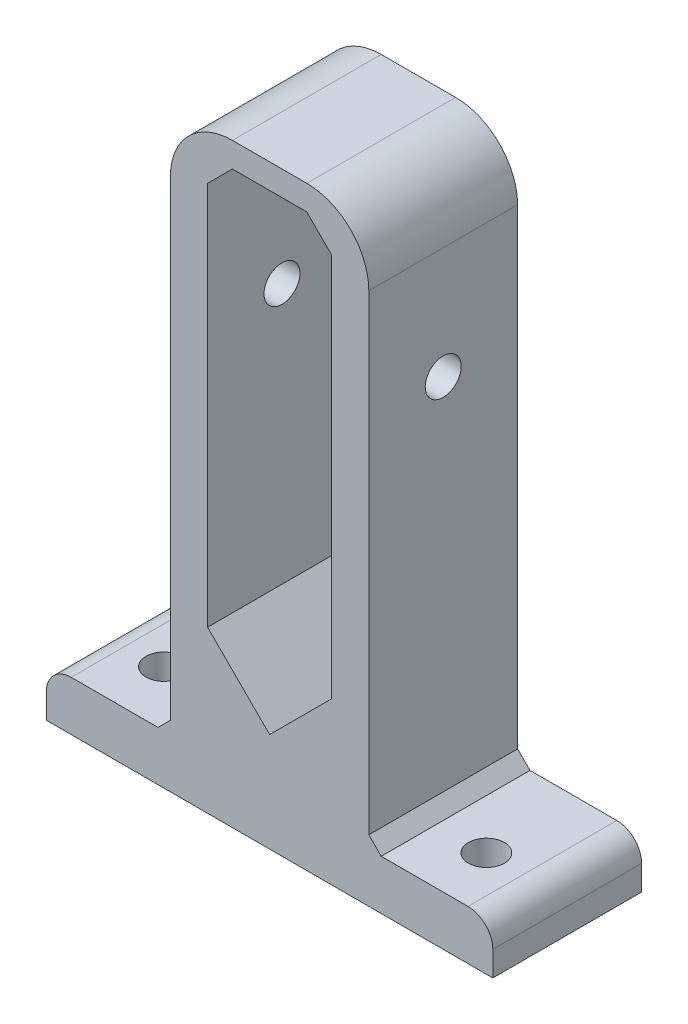
ISO-10303-21;
HEADER;
FILE_DESCRIPTION(('STEP AP214'),'2;1');
FILE_NAME('part.step','',(''),(''),'','','');
FILE_SCHEMA(('AUTOMOTIVE_DESIGN { 1 0 10303 214 1 1 1 1 }'));
ENDSEC;
DATA;
#1=APPLICATION_CONTEXT('core data for automotive mechanical design processes');
#2=APPLICATION_PROTOCOL_DEFINITION('international standard','automotive_design',2000,#1);
#3=PRODUCT_CONTEXT('',#1,'mechanical');
#4=PRODUCT('Part','Part','',(#3));
#5=PRODUCT_RELATED_PRODUCT_CATEGORY('part','',(#4));
#6=PRODUCT_DEFINITION_FORMATION('','',#4);
#7=PRODUCT_DEFINITION_CONTEXT('part definition',#1,'design');
#8=PRODUCT_DEFINITION('design','',#6,#7);
#9=PRODUCT_DEFINITION_SHAPE('','',#8);
#10=(LENGTH_UNIT() NAMED_UNIT(*) SI_UNIT(.MILLI.,.METRE.));
#11=(NAMED_UNIT(*) PLANE_ANGLE_UNIT() SI_UNIT($,.RADIAN.));
#12=(NAMED_UNIT(*) SI_UNIT($,.STERADIAN.) SOLID_ANGLE_UNIT());
#13=UNCERTAINTY_MEASURE_WITH_UNIT(LENGTH_MEASURE(1.E-05),#10,'distance_accuracy_value','');
#14=(GEOMETRIC_REPRESENTATION_CONTEXT(3) GLOBAL_UNCERTAINTY_ASSIGNED_CONTEXT((#13)) GLOBAL_UNIT_ASSIGNED_CONTEXT((#10,
#11,#12)) REPRESENTATION_CONTEXT('',''));
#15=CARTESIAN_POINT('',(0.,0.,0.));
#16=DIRECTION('',(0.,0.,1.));
#17=DIRECTION('',(1.,0.,0.));
#18=AXIS2_PLACEMENT_3D('',#15,#16,#17);
#19=CARTESIAN_POINT('',(13.,0.,12.));
#20=DIRECTION('',(-1.,0.,0.));
#21=DIRECTION('',(0.,0.,1.));
#22=AXIS2_PLACEMENT_3D('',#19,#20,#21);
#23=PLANE('',#22);
#24=CARTESIAN_POINT('',(13.,33.9999999999999,6.));
#25=DIRECTION('',(-1.,0.,0.));
#26=DIRECTION('',(0.,0.,1.));
#27=AXIS2_PLACEMENT_3D('',#24,#25,#26);
#28=CIRCLE('',#27,1.45);
#29=CARTESIAN_POINT('',(13.,33.9999999999999,7.45));
#30=VERTEX_POINT('',#29);
#31=EDGE_CURVE('E401',#30,#30,#28,.F.);
#32=ORIENTED_EDGE('',*,*,#31,.F.);
#33=EDGE_LOOP('',(#32));
#34=FACE_BOUND('',#33,.T.);
#35=DIRECTION('',(0.,1.,0.));
#36=VECTOR('',#35,1.);
#37=CARTESIAN_POINT('',(13.,0.,12.));
#38=LINE('',#37,#36);
#39=CARTESIAN_POINT('',(13.,13.,12.));
#40=VERTEX_POINT('',#39);
#41=CARTESIAN_POINT('',(13.,44.,12.));
#42=VERTEX_POINT('',#41);
#43=EDGE_CURVE('E201',#40,#42,#38,.T.);
#44=ORIENTED_EDGE('',*,*,#43,.F.);
#45=DIRECTION('',(0.,0.,-1.));
#46=VECTOR('',#45,1.);
#47=CARTESIAN_POINT('',(13.,13.,0.));
#48=LINE('',#47,#46);
#49=CARTESIAN_POINT('',(13.,13.,0.));
#50=VERTEX_POINT('',#49);
#51=EDGE_CURVE('E275',#40,#50,#48,.T.);
#52=ORIENTED_EDGE('',*,*,#51,.T.);
#53=DIRECTION('',(0.,1.,0.));
#54=VECTOR('',#53,1.);
#55=CARTESIAN_POINT('',(13.,0.,0.));
#56=LINE('',#55,#54);
#57=CARTESIAN_POINT('',(13.,44.,0.));
#58=VERTEX_POINT('',#57);
#59=EDGE_CURVE('E400',#50,#58,#56,.T.);
#60=ORIENTED_EDGE('',*,*,#59,.T.);
#61=DIRECTION('',(0.,0.,1.));
#62=VECTOR('',#61,1.);
#63=CARTESIAN_POINT('',(13.,44.,12.));
#64=LINE('',#63,#62);
#65=EDGE_CURVE('E260',#58,#42,#64,.T.);
#66=ORIENTED_EDGE('',*,*,#65,.T.);
#67=EDGE_LOOP('',(#44,#52,#60,#66));
#68=FACE_BOUND('',#67,.T.);
#69=ADVANCED_FACE('F35',(#34,#68),#23,.F.);
#70=CARTESIAN_POINT('',(22.9999999999997,0.,12.));
#71=DIRECTION('',(1.,0.,0.));
#72=DIRECTION('',(0.,1.,0.));
#73=AXIS2_PLACEMENT_3D('',#70,#71,#72);
#74=PLANE('',#73);
#75=CARTESIAN_POINT('',(22.9999999999999,33.9999999999999,6.));
#76=DIRECTION('',(1.,0.,0.));
#77=DIRECTION('',(0.,1.,0.));
#78=AXIS2_PLACEMENT_3D('',#75,#76,#77);
#79=CIRCLE('',#78,1.45);
#80=CARTESIAN_POINT('',(22.9999999999999,35.4499999999999,6.));
#81=VERTEX_POINT('',#80);
#82=EDGE_CURVE('E426',#81,#81,#79,.F.);
#83=ORIENTED_EDGE('',*,*,#82,.F.);
#84=EDGE_LOOP('',(#83));
#85=FACE_BOUND('',#84,.T.);
#86=DIRECTION('',(0.,-1.,0.));
#87=VECTOR('',#86,1.);
#88=CARTESIAN_POINT('',(22.9999999999997,0.,0.));
#89=LINE('',#88,#87);
#90=CARTESIAN_POINT('',(23.,44.,0.));
#91=VERTEX_POINT('',#90);
#92=CARTESIAN_POINT('',(22.9999999999998,12.9999999999998,0.));
#93=VERTEX_POINT('',#92);
#94=EDGE_CURVE('E406',#91,#93,#89,.T.);
#95=ORIENTED_EDGE('',*,*,#94,.T.);
#96=DIRECTION('',(0.,0.,1.));
#97=VECTOR('',#96,1.);
#98=CARTESIAN_POINT('',(22.9999999999998,12.9999999999998,12.));
#99=LINE('',#98,#97);
#100=CARTESIAN_POINT('',(22.9999999999998,12.9999999999998,12.));
#101=VERTEX_POINT('',#100);
#102=EDGE_CURVE('E278',#93,#101,#99,.T.);
#103=ORIENTED_EDGE('',*,*,#102,.T.);
#104=DIRECTION('',(0.,-1.,0.));
#105=VECTOR('',#104,1.);
#106=CARTESIAN_POINT('',(22.9999999999997,0.,12.));
#107=LINE('',#106,#105);
#108=CARTESIAN_POINT('',(23.,44.,12.));
#109=VERTEX_POINT('',#108);
#110=EDGE_CURVE('E414',#109,#101,#107,.T.);
#111=ORIENTED_EDGE('',*,*,#110,.F.);
#112=DIRECTION('',(0.,0.,-1.));
#113=VECTOR('',#112,1.);
#114=CARTESIAN_POINT('',(23.,44.,0.));
#115=LINE('',#114,#113);
#116=EDGE_CURVE('E263',#109,#91,#115,.T.);
#117=ORIENTED_EDGE('',*,*,#116,.T.);
#118=EDGE_LOOP('',(#95,#103,#111,#117));
#119=FACE_BOUND('',#118,.T.);
#120=ADVANCED_FACE('F363',(#85,#119),#74,.F.);
#121=CARTESIAN_POINT('',(0.,4.,12.));
#122=DIRECTION('',(1.,0.,0.));
#123=DIRECTION('',(0.,1.,0.));
#124=AXIS2_PLACEMENT_3D('',#121,#122,#123);
#125=PLANE('',#124);
#126=DIRECTION('',(0.,-1.,0.));
#127=VECTOR('',#126,1.);
#128=CARTESIAN_POINT('',(0.,4.,12.));
#129=LINE('',#128,#127);
#130=CARTESIAN_POINT('',(0.,2.,12.));
#131=VERTEX_POINT('',#130);
#132=CARTESIAN_POINT('',(0.,0.,12.));
#133=VERTEX_POINT('',#132);
#134=EDGE_CURVE('E178',#131,#133,#129,.T.);
#135=ORIENTED_EDGE('',*,*,#134,.F.);
#136=DIRECTION('',(0.,0.,-1.));
#137=VECTOR('',#136,1.);
#138=CARTESIAN_POINT('',(0.,2.,12.));
#139=LINE('',#138,#137);
#140=CARTESIAN_POINT('',(0.,2.,0.));
#141=VERTEX_POINT('',#140);
#142=EDGE_CURVE('E250',#131,#141,#139,.T.);
#143=ORIENTED_EDGE('',*,*,#142,.T.);
#144=DIRECTION('',(0.,-1.,0.));
#145=VECTOR('',#144,1.);
#146=CARTESIAN_POINT('',(0.,4.,0.));
#147=LINE('',#146,#145);
#148=CARTESIAN_POINT('',(0.,0.,0.));
#149=VERTEX_POINT('',#148);
#150=EDGE_CURVE('E206',#141,#149,#147,.T.);
#151=ORIENTED_EDGE('',*,*,#150,.T.);
#152=DIRECTION('',(0.,0.,-1.));
#153=VECTOR('',#152,1.);
#154=CARTESIAN_POINT('',(0.,0.,12.));
#155=LINE('',#154,#153);
#156=EDGE_CURVE('E197',#133,#149,#155,.T.);
#157=ORIENTED_EDGE('',*,*,#156,.F.);
#158=EDGE_LOOP('',(#135,#143,#151,#157));
#159=FACE_BOUND('',#158,.T.);
#160=ADVANCED_FACE('F204',(#159),#125,.F.);
#161=CARTESIAN_POINT('',(13.,46.,12.));
#162=DIRECTION('',(0.,1.,0.));
#163=DIRECTION('',(0.,0.,1.));
#164=AXIS2_PLACEMENT_3D('',#161,#162,#163);
#165=PLANE('',#164);
#166=DIRECTION('',(1.,0.,0.));
#167=VECTOR('',#166,1.);
#168=CARTESIAN_POINT('',(13.,46.,12.));
#169=LINE('',#168,#167);
#170=CARTESIAN_POINT('',(15.,46.,12.));
#171=VERTEX_POINT('',#170);
#172=CARTESIAN_POINT('',(21.,46.,12.));
#173=VERTEX_POINT('',#172);
#174=EDGE_CURVE('E418',#171,#173,#169,.T.);
#175=ORIENTED_EDGE('',*,*,#174,.F.);
#176=DIRECTION('',(0.,0.,-1.));
#177=VECTOR('',#176,1.);
#178=CARTESIAN_POINT('',(15.,46.,0.));
#179=LINE('',#178,#177);
#180=CARTESIAN_POINT('',(15.,46.,0.));
#181=VERTEX_POINT('',#180);
#182=EDGE_CURVE('E257',#171,#181,#179,.T.);
#183=ORIENTED_EDGE('',*,*,#182,.T.);
#184=DIRECTION('',(1.,0.,0.));
#185=VECTOR('',#184,1.);
#186=CARTESIAN_POINT('',(13.,46.,0.));
#187=LINE('',#186,#185);
#188=CARTESIAN_POINT('',(21.,46.,0.));
#189=VERTEX_POINT('',#188);
#190=EDGE_CURVE('E403',#181,#189,#187,.T.);
#191=ORIENTED_EDGE('',*,*,#190,.T.);
#192=DIRECTION('',(0.,0.,1.));
#193=VECTOR('',#192,1.);
#194=CARTESIAN_POINT('',(21.,46.,12.));
#195=LINE('',#194,#193);
#196=EDGE_CURVE('E255',#189,#173,#195,.T.);
#197=ORIENTED_EDGE('',*,*,#196,.T.);
#198=EDGE_LOOP('',(#175,#183,#191,#197));
#199=FACE_BOUND('',#198,.T.);
#200=ADVANCED_FACE('F375',(#199),#165,.F.);
#201=CARTESIAN_POINT('',(35.9999999999997,-1.2490009027033E-13,12.));
#202=DIRECTION('',(0.,1.,0.));
#203=DIRECTION('',(-1.,0.,0.));
#204=AXIS2_PLACEMENT_3D('',#201,#202,#203);
#205=PLANE('',#204);
#206=CARTESIAN_POINT('',(31.,0.,7.51917344477907));
#207=DIRECTION('',(0.,1.,0.));
#208=DIRECTION('',(-1.,0.,0.));
#209=AXIS2_PLACEMENT_3D('',#206,#207,#208);
#210=CIRCLE('',#209,1.45);
#211=CARTESIAN_POINT('',(29.55,0.,7.51917344477907));
#212=VERTEX_POINT('',#211);
#213=EDGE_CURVE('E218',#212,#212,#210,.T.);
#214=ORIENTED_EDGE('',*,*,#213,.T.);
#215=EDGE_LOOP('',(#214));
#216=FACE_BOUND('',#215,.T.);
#217=DIRECTION('',(1.,0.,0.));
#218=VECTOR('',#217,1.);
#219=CARTESIAN_POINT('',(35.9999999999997,-1.2490009027033E-13,0.));
#220=LINE('',#219,#218);
#221=CARTESIAN_POINT('',(35.9999999999997,-1.2490009027033E-13,0.));
#222=VERTEX_POINT('',#221);
#223=EDGE_CURVE('E334',#149,#222,#220,.T.);
#224=ORIENTED_EDGE('',*,*,#223,.T.);
#225=DIRECTION('',(0.,0.,-1.));
#226=VECTOR('',#225,1.);
#227=CARTESIAN_POINT('',(35.9999999999997,-1.2490009027033E-13,12.));
#228=LINE('',#227,#226);
#229=CARTESIAN_POINT('',(35.9999999999997,-1.2490009027033E-13,12.));
#230=VERTEX_POINT('',#229);
#231=EDGE_CURVE('E199',#230,#222,#228,.T.);
#232=ORIENTED_EDGE('',*,*,#231,.F.);
#233=DIRECTION('',(1.,0.,0.));
#234=VECTOR('',#233,1.);
#235=CARTESIAN_POINT('',(0.,0.,12.));
#236=LINE('',#235,#234);
#237=EDGE_CURVE('E183',#133,#230,#236,.T.);
#238=ORIENTED_EDGE('',*,*,#237,.F.);
#239=ORIENTED_EDGE('',*,*,#156,.T.);
#240=EDGE_LOOP('',(#224,#232,#238,#239));
#241=FACE_BOUND('',#240,.T.);
#242=CARTESIAN_POINT('',(5.,0.,7.51917344477907));
#243=DIRECTION('',(0.,1.,0.));
#244=DIRECTION('',(0.,0.,1.));
#245=AXIS2_PLACEMENT_3D('',#242,#243,#244);
#246=CIRCLE('',#245,1.45);
#247=CARTESIAN_POINT('',(5.,0.,8.96917344477908));
#248=VERTEX_POINT('',#247);
#249=EDGE_CURVE('E433',#248,#248,#246,.T.);
#250=ORIENTED_EDGE('',*,*,#249,.T.);
#251=EDGE_LOOP('',(#250));
#252=FACE_BOUND('',#251,.T.);
#253=ADVANCED_FACE('F195',(#216,#241,#252),#205,.F.);
#254=CARTESIAN_POINT('',(36.,4.,12.));
#255=DIRECTION('',(-1.,0.,0.));
#256=DIRECTION('',(0.,-1.,0.));
#257=AXIS2_PLACEMENT_3D('',#254,#255,#256);
#258=PLANE('',#257);
#259=DIRECTION('',(0.,1.,0.));
#260=VECTOR('',#259,1.);
#261=CARTESIAN_POINT('',(36.,4.,0.));
#262=LINE('',#261,#260);
#263=CARTESIAN_POINT('',(35.9999999999998,1.99999999999986,0.));
#264=VERTEX_POINT('',#263);
#265=EDGE_CURVE('E329',#222,#264,#262,.T.);
#266=ORIENTED_EDGE('',*,*,#265,.T.);
#267=DIRECTION('',(0.,0.,-1.));
#268=VECTOR('',#267,1.);
#269=CARTESIAN_POINT('',(35.9999999999998,1.99999999999986,12.));
#270=LINE('',#269,#268);
#271=CARTESIAN_POINT('',(35.9999999999998,1.99999999999986,12.));
#272=VERTEX_POINT('',#271);
#273=EDGE_CURVE('E245',#264,#272,#270,.F.);
#274=ORIENTED_EDGE('',*,*,#273,.T.);
#275=DIRECTION('',(0.,1.,0.));
#276=VECTOR('',#275,1.);
#277=CARTESIAN_POINT('',(36.,4.,12.));
#278=LINE('',#277,#276);
#279=EDGE_CURVE('E412',#230,#272,#278,.T.);
#280=ORIENTED_EDGE('',*,*,#279,.F.);
#281=ORIENTED_EDGE('',*,*,#231,.T.);
#282=EDGE_LOOP('',(#266,#274,#280,#281));
#283=FACE_BOUND('',#282,.T.);
#284=ADVANCED_FACE('F410',(#283),#258,.F.);
#285=CARTESIAN_POINT('',(26.,4.,12.));
#286=DIRECTION('',(0.,-1.,0.));
#287=DIRECTION('',(1.,0.,0.));
#288=AXIS2_PLACEMENT_3D('',#285,#286,#287);
#289=PLANE('',#288);
#290=CARTESIAN_POINT('',(31.,4.,7.51917344477907));
#291=DIRECTION('',(0.,1.,0.));
#292=DIRECTION('',(1.,0.,0.));
#293=AXIS2_PLACEMENT_3D('',#290,#291,#292);
#294=CIRCLE('',#293,1.45);
#295=CARTESIAN_POINT('',(32.45,4.,7.51917344477907));
#296=VERTEX_POINT('',#295);
#297=EDGE_CURVE('E292',#296,#296,#294,.T.);
#298=ORIENTED_EDGE('',*,*,#297,.F.);
#299=EDGE_LOOP('',(#298));
#300=FACE_BOUND('',#299,.T.);
#301=DIRECTION('',(-1.,0.,0.));
#302=VECTOR('',#301,1.);
#303=CARTESIAN_POINT('',(26.,4.,0.));
#304=LINE('',#303,#302);
#305=CARTESIAN_POINT('',(33.9999999999998,4.,0.));
#306=VERTEX_POINT('',#305);
#307=CARTESIAN_POINT('',(27.,4.,0.));
#308=VERTEX_POINT('',#307);
#309=EDGE_CURVE('E324',#306,#308,#304,.T.);
#310=ORIENTED_EDGE('',*,*,#309,.T.);
#311=DIRECTION('',(0.,0.,1.));
#312=VECTOR('',#311,1.);
#313=CARTESIAN_POINT('',(27.,4.,12.));
#314=LINE('',#313,#312);
#315=CARTESIAN_POINT('',(27.,4.,12.));
#316=VERTEX_POINT('',#315);
#317=EDGE_CURVE('E295',#308,#316,#314,.T.);
#318=ORIENTED_EDGE('',*,*,#317,.T.);
#319=DIRECTION('',(-1.,0.,0.));
#320=VECTOR('',#319,1.);
#321=CARTESIAN_POINT('',(26.,4.,12.));
#322=LINE('',#321,#320);
#323=CARTESIAN_POINT('',(33.9999999999998,4.,12.));
#324=VERTEX_POINT('',#323);
#325=EDGE_CURVE('E309',#324,#316,#322,.T.);
#326=ORIENTED_EDGE('',*,*,#325,.F.);
#327=DIRECTION('',(0.,0.,-1.));
#328=VECTOR('',#327,1.);
#329=CARTESIAN_POINT('',(33.9999999999998,4.,12.));
#330=LINE('',#329,#328);
#331=EDGE_CURVE('E237',#324,#306,#330,.T.);
#332=ORIENTED_EDGE('',*,*,#331,.T.);
#333=EDGE_LOOP('',(#310,#318,#326,#332));
#334=FACE_BOUND('',#333,.T.);
#335=ADVANCED_FACE('F327',(#300,#334),#289,.F.);
#336=CARTESIAN_POINT('',(26.,48.,12.));
#337=DIRECTION('',(-1.,0.,0.));
#338=DIRECTION('',(0.,-1.,0.));
#339=AXIS2_PLACEMENT_3D('',#336,#337,#338);
#340=PLANE('',#339);
#341=CARTESIAN_POINT('',(26.,33.9999999999999,6.));
#342=DIRECTION('',(-1.,0.,0.));
#343=DIRECTION('',(0.,-1.,0.));
#344=AXIS2_PLACEMENT_3D('',#341,#342,#343);
#345=CIRCLE('',#344,1.45);
#346=CARTESIAN_POINT('',(26.,32.5499999999999,6.));
#347=VERTEX_POINT('',#346);
#348=EDGE_CURVE('E217',#347,#347,#345,.F.);
#349=ORIENTED_EDGE('',*,*,#348,.F.);
#350=EDGE_LOOP('',(#349));
#351=FACE_BOUND('',#350,.T.);
#352=DIRECTION('',(0.,1.,0.));
#353=VECTOR('',#352,1.);
#354=CARTESIAN_POINT('',(26.,48.,12.));
#355=LINE('',#354,#353);
#356=CARTESIAN_POINT('',(26.,5.00000000000001,12.));
#357=VERTEX_POINT('',#356);
#358=CARTESIAN_POINT('',(26.,43.,12.));
#359=VERTEX_POINT('',#358);
#360=EDGE_CURVE('E307',#357,#359,#355,.T.);
#361=ORIENTED_EDGE('',*,*,#360,.F.);
#362=DIRECTION('',(0.,0.,-1.));
#363=VECTOR('',#362,1.);
#364=CARTESIAN_POINT('',(26.,5.00000000000001,0.));
#365=LINE('',#364,#363);
#366=CARTESIAN_POINT('',(26.,5.00000000000001,0.));
#367=VERTEX_POINT('',#366);
#368=EDGE_CURVE('E288',#357,#367,#365,.T.);
#369=ORIENTED_EDGE('',*,*,#368,.T.);
#370=DIRECTION('',(0.,1.,0.));
#371=VECTOR('',#370,1.);
#372=CARTESIAN_POINT('',(26.,48.,0.));
#373=LINE('',#372,#371);
#374=CARTESIAN_POINT('',(26.,43.,0.));
#375=VERTEX_POINT('',#374);
#376=EDGE_CURVE('E325',#367,#375,#373,.T.);
#377=ORIENTED_EDGE('',*,*,#376,.T.);
#378=DIRECTION('',(0.,0.,-1.));
#379=VECTOR('',#378,1.);
#380=CARTESIAN_POINT('',(26.,43.,12.));
#381=LINE('',#380,#379);
#382=EDGE_CURVE('E227',#375,#359,#381,.F.);
#383=ORIENTED_EDGE('',*,*,#382,.T.);
#384=EDGE_LOOP('',(#361,#369,#377,#383));
#385=FACE_BOUND('',#384,.T.);
#386=ADVANCED_FACE('F314',(#351,#385),#340,.F.);
#387=CARTESIAN_POINT('',(26.,48.,12.));
#388=DIRECTION('',(0.,-1.,0.));
#389=DIRECTION('',(0.,0.,-1.));
#390=AXIS2_PLACEMENT_3D('',#387,#388,#389);
#391=PLANE('',#390);
#392=DIRECTION('',(-1.,0.,0.));
#393=VECTOR('',#392,1.);
#394=CARTESIAN_POINT('',(26.,48.,12.));
#395=LINE('',#394,#393);
#396=CARTESIAN_POINT('',(21.,48.,12.));
#397=VERTEX_POINT('',#396);
#398=CARTESIAN_POINT('',(15.,48.,12.));
#399=VERTEX_POINT('',#398);
#400=EDGE_CURVE('E318',#397,#399,#395,.T.);
#401=ORIENTED_EDGE('',*,*,#400,.F.);
#402=DIRECTION('',(0.,0.,-1.));
#403=VECTOR('',#402,1.);
#404=CARTESIAN_POINT('',(21.,48.,12.));
#405=LINE('',#404,#403);
#406=CARTESIAN_POINT('',(21.,48.,0.));
#407=VERTEX_POINT('',#406);
#408=EDGE_CURVE('E209',#397,#407,#405,.T.);
#409=ORIENTED_EDGE('',*,*,#408,.T.);
#410=DIRECTION('',(-1.,0.,0.));
#411=VECTOR('',#410,1.);
#412=CARTESIAN_POINT('',(26.,48.,0.));
#413=LINE('',#412,#411);
#414=CARTESIAN_POINT('',(15.,48.,0.));
#415=VERTEX_POINT('',#414);
#416=EDGE_CURVE('E331',#407,#415,#413,.T.);
#417=ORIENTED_EDGE('',*,*,#416,.T.);
#418=DIRECTION('',(0.,0.,-1.));
#419=VECTOR('',#418,1.);
#420=CARTESIAN_POINT('',(15.,48.,12.));
#421=LINE('',#420,#419);
#422=EDGE_CURVE('E207',#415,#399,#421,.F.);
#423=ORIENTED_EDGE('',*,*,#422,.T.);
#424=EDGE_LOOP('',(#401,#409,#417,#423));
#425=FACE_BOUND('',#424,.T.);
#426=ADVANCED_FACE('F452',(#425),#391,.F.);
#427=CARTESIAN_POINT('',(9.99999999999999,48.,12.));
#428=DIRECTION('',(1.,0.,0.));
#429=DIRECTION('',(0.,1.,0.));
#430=AXIS2_PLACEMENT_3D('',#427,#428,#429);
#431=PLANE('',#430);
#432=CARTESIAN_POINT('',(9.99999999999999,33.9999999999999,6.));
#433=DIRECTION('',(1.,0.,0.));
#434=DIRECTION('',(0.,1.,0.));
#435=AXIS2_PLACEMENT_3D('',#432,#433,#434);
#436=CIRCLE('',#435,1.45);
#437=CARTESIAN_POINT('',(9.99999999999999,35.4499999999999,6.));
#438=VERTEX_POINT('',#437);
#439=EDGE_CURVE('E215',#438,#438,#436,.F.);
#440=ORIENTED_EDGE('',*,*,#439,.F.);
#441=EDGE_LOOP('',(#440));
#442=FACE_BOUND('',#441,.T.);
#443=DIRECTION('',(0.,-1.,0.));
#444=VECTOR('',#443,1.);
#445=CARTESIAN_POINT('',(9.99999999999999,48.,0.));
#446=LINE('',#445,#444);
#447=CARTESIAN_POINT('',(9.99999999999999,43.,0.));
#448=VERTEX_POINT('',#447);
#449=CARTESIAN_POINT('',(10.,5.,0.));
#450=VERTEX_POINT('',#449);
#451=EDGE_CURVE('E340',#448,#450,#446,.T.);
#452=ORIENTED_EDGE('',*,*,#451,.T.);
#453=DIRECTION('',(0.,0.,1.));
#454=VECTOR('',#453,1.);
#455=CARTESIAN_POINT('',(10.,5.,12.));
#456=LINE('',#455,#454);
#457=CARTESIAN_POINT('',(10.,5.,12.));
#458=VERTEX_POINT('',#457);
#459=EDGE_CURVE('E57',#450,#458,#456,.T.);
#460=ORIENTED_EDGE('',*,*,#459,.T.);
#461=DIRECTION('',(0.,-1.,0.));
#462=VECTOR('',#461,1.);
#463=CARTESIAN_POINT('',(9.99999999999999,48.,12.));
#464=LINE('',#463,#462);
#465=CARTESIAN_POINT('',(9.99999999999999,43.,12.));
#466=VERTEX_POINT('',#465);
#467=EDGE_CURVE('E391',#466,#458,#464,.T.);
#468=ORIENTED_EDGE('',*,*,#467,.F.);
#469=DIRECTION('',(0.,0.,-1.));
#470=VECTOR('',#469,1.);
#471=CARTESIAN_POINT('',(9.99999999999999,43.,12.));
#472=LINE('',#471,#470);
#473=EDGE_CURVE('E234',#466,#448,#472,.T.);
#474=ORIENTED_EDGE('',*,*,#473,.T.);
#475=EDGE_LOOP('',(#452,#460,#468,#474));
#476=FACE_BOUND('',#475,.T.);
#477=ADVANCED_FACE('F394',(#442,#476),#431,.F.);
#478=CARTESIAN_POINT('',(10.,4.,12.));
#479=DIRECTION('',(0.,-1.,0.));
#480=DIRECTION('',(1.,0.,0.));
#481=AXIS2_PLACEMENT_3D('',#478,#479,#480);
#482=PLANE('',#481);
#483=CARTESIAN_POINT('',(5.,4.,7.51917344477907));
#484=DIRECTION('',(0.,1.,0.));
#485=DIRECTION('',(-1.,0.,0.));
#486=AXIS2_PLACEMENT_3D('',#483,#484,#485);
#487=CIRCLE('',#486,1.45);
#488=CARTESIAN_POINT('',(3.55,4.,7.51917344477907));
#489=VERTEX_POINT('',#488);
#490=EDGE_CURVE('E436',#489,#489,#487,.T.);
#491=ORIENTED_EDGE('',*,*,#490,.F.);
#492=EDGE_LOOP('',(#491));
#493=FACE_BOUND('',#492,.T.);
#494=DIRECTION('',(-1.,0.,0.));
#495=VECTOR('',#494,1.);
#496=CARTESIAN_POINT('',(10.,4.,12.));
#497=LINE('',#496,#495);
#498=CARTESIAN_POINT('',(8.99999999999999,4.,12.));
#499=VERTEX_POINT('',#498);
#500=CARTESIAN_POINT('',(2.,4.,12.));
#501=VERTEX_POINT('',#500);
#502=EDGE_CURVE('E211',#499,#501,#497,.T.);
#503=ORIENTED_EDGE('',*,*,#502,.F.);
#504=DIRECTION('',(0.,0.,-1.));
#505=VECTOR('',#504,1.);
#506=CARTESIAN_POINT('',(8.99999999999999,4.,0.));
#507=LINE('',#506,#505);
#508=CARTESIAN_POINT('',(8.99999999999999,4.,0.));
#509=VERTEX_POINT('',#508);
#510=EDGE_CURVE('E297',#499,#509,#507,.T.);
#511=ORIENTED_EDGE('',*,*,#510,.T.);
#512=DIRECTION('',(-1.,0.,0.));
#513=VECTOR('',#512,1.);
#514=CARTESIAN_POINT('',(10.,4.,0.));
#515=LINE('',#514,#513);
#516=CARTESIAN_POINT('',(2.,4.,0.));
#517=VERTEX_POINT('',#516);
#518=EDGE_CURVE('E191',#509,#517,#515,.T.);
#519=ORIENTED_EDGE('',*,*,#518,.T.);
#520=DIRECTION('',(0.,0.,-1.));
#521=VECTOR('',#520,1.);
#522=CARTESIAN_POINT('',(2.,4.,12.));
#523=LINE('',#522,#521);
#524=EDGE_CURVE('E252',#517,#501,#523,.F.);
#525=ORIENTED_EDGE('',*,*,#524,.T.);
#526=EDGE_LOOP('',(#503,#511,#519,#525));
#527=FACE_BOUND('',#526,.T.);
#528=ADVANCED_FACE('F343',(#493,#527),#482,.F.);
#529=CARTESIAN_POINT('',(0.,0.,12.));
#530=DIRECTION('',(0.,0.,1.));
#531=DIRECTION('',(1.,0.,0.));
#532=AXIS2_PLACEMENT_3D('',#529,#530,#531);
#533=PLANE('',#532);
#534=ORIENTED_EDGE('',*,*,#237,.T.);
#535=ORIENTED_EDGE('',*,*,#279,.T.);
#536=CARTESIAN_POINT('',(33.9999999999998,2.,12.));
#537=DIRECTION('',(0.,0.,1.));
#538=DIRECTION('',(1.,0.,0.));
#539=AXIS2_PLACEMENT_3D('',#536,#537,#538);
#540=CIRCLE('',#539,2.);
#541=EDGE_CURVE('E248',#272,#324,#540,.T.);
#542=ORIENTED_EDGE('',*,*,#541,.T.);
#543=ORIENTED_EDGE('',*,*,#325,.T.);
#544=DIRECTION('',(0.707106781186545,-0.70710678118655,0.));
#545=VECTOR('',#544,1.);
#546=CARTESIAN_POINT('',(26.,5.00000000000001,12.));
#547=LINE('',#546,#545);
#548=EDGE_CURVE('E303',#316,#357,#547,.F.);
#549=ORIENTED_EDGE('',*,*,#548,.T.);
#550=ORIENTED_EDGE('',*,*,#360,.T.);
#551=CARTESIAN_POINT('',(21.,43.,12.));
#552=DIRECTION('',(0.,0.,1.));
#553=DIRECTION('',(1.,0.,0.));
#554=AXIS2_PLACEMENT_3D('',#551,#552,#553);
#555=CIRCLE('',#554,5.);
#556=EDGE_CURVE('E232',#359,#397,#555,.T.);
#557=ORIENTED_EDGE('',*,*,#556,.T.);
#558=ORIENTED_EDGE('',*,*,#400,.T.);
#559=CARTESIAN_POINT('',(15.,43.,12.));
#560=DIRECTION('',(0.,0.,1.));
#561=DIRECTION('',(1.,0.,0.));
#562=AXIS2_PLACEMENT_3D('',#559,#560,#561);
#563=CIRCLE('',#562,5.);
#564=EDGE_CURVE('E230',#399,#466,#563,.T.);
#565=ORIENTED_EDGE('',*,*,#564,.T.);
#566=ORIENTED_EDGE('',*,*,#467,.T.);
#567=DIRECTION('',(0.707106781186551,0.707106781186544,0.));
#568=VECTOR('',#567,1.);
#569=CARTESIAN_POINT('',(8.99999999999999,4.,12.));
#570=LINE('',#569,#568);
#571=EDGE_CURVE('E11',#458,#499,#570,.F.);
#572=ORIENTED_EDGE('',*,*,#571,.T.);
#573=ORIENTED_EDGE('',*,*,#502,.T.);
#574=CARTESIAN_POINT('',(2.,2.,12.));
#575=DIRECTION('',(0.,0.,1.));
#576=DIRECTION('',(1.,0.,0.));
#577=AXIS2_PLACEMENT_3D('',#574,#575,#576);
#578=CIRCLE('',#577,2.);
#579=EDGE_CURVE('E186',#501,#131,#578,.T.);
#580=ORIENTED_EDGE('',*,*,#579,.T.);
#581=ORIENTED_EDGE('',*,*,#134,.T.);
#582=EDGE_LOOP('',(#534,#535,#542,#543,#549,#550,#557,#558,#565,#566,#572,#573,#580,#581));
#583=FACE_BOUND('',#582,.T.);
#584=ORIENTED_EDGE('',*,*,#110,.T.);
#585=DIRECTION('',(0.707106781186544,0.707106781186551,0.));
#586=VECTOR('',#585,1.);
#587=CARTESIAN_POINT('',(22.9999999999998,12.9999999999998,12.));
#588=LINE('',#587,#586);
#589=CARTESIAN_POINT('',(18.,8.,12.));
#590=VERTEX_POINT('',#589);
#591=EDGE_CURVE('E284',#101,#590,#588,.F.);
#592=ORIENTED_EDGE('',*,*,#591,.T.);
#593=DIRECTION('',(0.707106781186551,-0.707106781186544,0.));
#594=VECTOR('',#593,1.);
#595=CARTESIAN_POINT('',(18.,8.,12.));
#596=LINE('',#595,#594);
#597=EDGE_CURVE('E280',#590,#40,#596,.F.);
#598=ORIENTED_EDGE('',*,*,#597,.T.);
#599=ORIENTED_EDGE('',*,*,#43,.T.);
#600=DIRECTION('',(-0.707106781186551,-0.707106781186544,0.));
#601=VECTOR('',#600,1.);
#602=CARTESIAN_POINT('',(15.,46.,12.));
#603=LINE('',#602,#601);
#604=EDGE_CURVE('E269',#42,#171,#603,.F.);
#605=ORIENTED_EDGE('',*,*,#604,.T.);
#606=ORIENTED_EDGE('',*,*,#174,.T.);
#607=DIRECTION('',(-0.707106781186544,0.707106781186551,0.));
#608=VECTOR('',#607,1.);
#609=CARTESIAN_POINT('',(23.,44.,12.));
#610=LINE('',#609,#608);
#611=EDGE_CURVE('E273',#173,#109,#610,.F.);
#612=ORIENTED_EDGE('',*,*,#611,.T.);
#613=EDGE_LOOP('',(#584,#592,#598,#599,#605,#606,#612));
#614=FACE_BOUND('',#613,.T.);
#615=ADVANCED_FACE('F180',(#583,#614),#533,.T.);
#616=CARTESIAN_POINT('',(0.,0.,0.));
#617=DIRECTION('',(0.,0.,1.));
#618=DIRECTION('',(1.,0.,0.));
#619=AXIS2_PLACEMENT_3D('',#616,#617,#618);
#620=PLANE('',#619);
#621=DIRECTION('',(-0.707106781186551,0.707106781186544,0.));
#622=VECTOR('',#621,1.);
#623=CARTESIAN_POINT('',(12.9999999999999,13.0000000000001,0.));
#624=LINE('',#623,#622);
#625=CARTESIAN_POINT('',(18.,8.,0.));
#626=VERTEX_POINT('',#625);
#627=EDGE_CURVE('E282',#50,#626,#624,.F.);
#628=ORIENTED_EDGE('',*,*,#627,.T.);
#629=DIRECTION('',(-0.707106781186544,-0.707106781186551,0.));
#630=VECTOR('',#629,1.);
#631=CARTESIAN_POINT('',(5.00000000000011,-5.00000000000005,0.));
#632=LINE('',#631,#630);
#633=EDGE_CURVE('E286',#626,#93,#632,.F.);
#634=ORIENTED_EDGE('',*,*,#633,.T.);
#635=ORIENTED_EDGE('',*,*,#94,.F.);
#636=DIRECTION('',(0.707106781186544,-0.707106781186551,0.));
#637=VECTOR('',#636,1.);
#638=CARTESIAN_POINT('',(33.5000000000001,33.4999999999998,0.));
#639=LINE('',#638,#637);
#640=EDGE_CURVE('E271',#91,#189,#639,.F.);
#641=ORIENTED_EDGE('',*,*,#640,.T.);
#642=ORIENTED_EDGE('',*,*,#190,.F.);
#643=DIRECTION('',(0.707106781186551,0.707106781186544,0.));
#644=VECTOR('',#643,1.);
#645=CARTESIAN_POINT('',(-15.5000000000001,15.5000000000002,0.));
#646=LINE('',#645,#644);
#647=EDGE_CURVE('E266',#181,#58,#646,.F.);
#648=ORIENTED_EDGE('',*,*,#647,.T.);
#649=ORIENTED_EDGE('',*,*,#59,.F.);
#650=EDGE_LOOP('',(#628,#634,#635,#641,#642,#648,#649));
#651=FACE_BOUND('',#650,.T.);
#652=ORIENTED_EDGE('',*,*,#309,.F.);
#653=CARTESIAN_POINT('',(33.9999999999998,2.,0.));
#654=DIRECTION('',(0.,0.,1.));
#655=DIRECTION('',(1.,0.,0.));
#656=AXIS2_PLACEMENT_3D('',#653,#654,#655);
#657=CIRCLE('',#656,2.);
#658=EDGE_CURVE('E243',#306,#264,#657,.F.);
#659=ORIENTED_EDGE('',*,*,#658,.T.);
#660=ORIENTED_EDGE('',*,*,#265,.F.);
#661=ORIENTED_EDGE('',*,*,#223,.F.);
#662=ORIENTED_EDGE('',*,*,#150,.F.);
#663=CARTESIAN_POINT('',(2.,2.,0.));
#664=DIRECTION('',(0.,0.,1.));
#665=DIRECTION('',(1.,0.,0.));
#666=AXIS2_PLACEMENT_3D('',#663,#664,#665);
#667=CIRCLE('',#666,2.);
#668=EDGE_CURVE('E240',#141,#517,#667,.F.);
#669=ORIENTED_EDGE('',*,*,#668,.T.);
#670=ORIENTED_EDGE('',*,*,#518,.F.);
#671=DIRECTION('',(-0.707106781186551,-0.707106781186544,0.));
#672=VECTOR('',#671,1.);
#673=CARTESIAN_POINT('',(2.49999999999995,-2.49999999999997,0.));
#674=LINE('',#673,#672);
#675=EDGE_CURVE('E44',#509,#450,#674,.F.);
#676=ORIENTED_EDGE('',*,*,#675,.T.);
#677=ORIENTED_EDGE('',*,*,#451,.F.);
#678=CARTESIAN_POINT('',(15.,43.,0.));
#679=DIRECTION('',(0.,0.,1.));
#680=DIRECTION('',(1.,0.,0.));
#681=AXIS2_PLACEMENT_3D('',#678,#679,#680);
#682=CIRCLE('',#681,5.);
#683=EDGE_CURVE('E222',#448,#415,#682,.F.);
#684=ORIENTED_EDGE('',*,*,#683,.T.);
#685=ORIENTED_EDGE('',*,*,#416,.F.);
#686=CARTESIAN_POINT('',(21.,43.,0.));
#687=DIRECTION('',(0.,0.,1.));
#688=DIRECTION('',(1.,0.,0.));
#689=AXIS2_PLACEMENT_3D('',#686,#687,#688);
#690=CIRCLE('',#689,5.);
#691=EDGE_CURVE('E224',#407,#375,#690,.F.);
#692=ORIENTED_EDGE('',*,*,#691,.T.);
#693=ORIENTED_EDGE('',*,*,#376,.F.);
#694=DIRECTION('',(-0.707106781186545,0.70710678118655,0.));
#695=VECTOR('',#694,1.);
#696=CARTESIAN_POINT('',(15.5000000000001,15.5,0.));
#697=LINE('',#696,#695);
#698=EDGE_CURVE('E301',#367,#308,#697,.F.);
#699=ORIENTED_EDGE('',*,*,#698,.T.);
#700=EDGE_LOOP('',(#652,#659,#660,#661,#662,#669,#670,#676,#677,#684,#685,#692,#693,#699));
#701=FACE_BOUND('',#700,.T.);
#702=ADVANCED_FACE('F323',(#651,#701),#620,.F.);
#703=CARTESIAN_POINT('',(28.,33.9999999999999,6.));
#704=DIRECTION('',(-1.,0.,0.));
#705=DIRECTION('',(0.,-1.,0.));
#706=AXIS2_PLACEMENT_3D('',#703,#704,#705);
#707=CYLINDRICAL_SURFACE('',#706,1.45);
#708=ORIENTED_EDGE('',*,*,#439,.T.);
#709=EDGE_LOOP('',(#708));
#710=FACE_BOUND('',#709,.T.);
#711=ORIENTED_EDGE('',*,*,#31,.T.);
#712=EDGE_LOOP('',(#711));
#713=FACE_BOUND('',#712,.T.);
#714=ADVANCED_FACE('F485',(#710,#713),#707,.F.);
#715=ORIENTED_EDGE('',*,*,#348,.T.);
#716=EDGE_LOOP('',(#715));
#717=FACE_BOUND('',#716,.T.);
#718=ORIENTED_EDGE('',*,*,#82,.T.);
#719=EDGE_LOOP('',(#718));
#720=FACE_BOUND('',#719,.T.);
#721=ADVANCED_FACE('F482',(#717,#720),#707,.F.);
#722=CARTESIAN_POINT('',(5.,-11.,7.51917344477907));
#723=DIRECTION('',(0.,1.,0.));
#724=DIRECTION('',(-1.,0.,0.));
#725=AXIS2_PLACEMENT_3D('',#722,#723,#724);
#726=CYLINDRICAL_SURFACE('',#725,1.45);
#727=ORIENTED_EDGE('',*,*,#490,.T.);
#728=EDGE_LOOP('',(#727));
#729=FACE_BOUND('',#728,.T.);
#730=ORIENTED_EDGE('',*,*,#249,.F.);
#731=EDGE_LOOP('',(#730));
#732=FACE_BOUND('',#731,.T.);
#733=ADVANCED_FACE('F442',(#729,#732),#726,.F.);
#734=CARTESIAN_POINT('',(31.,-11.,7.51917344477907));
#735=DIRECTION('',(0.,1.,0.));
#736=DIRECTION('',(-1.,0.,0.));
#737=AXIS2_PLACEMENT_3D('',#734,#735,#736);
#738=CYLINDRICAL_SURFACE('',#737,1.45);
#739=ORIENTED_EDGE('',*,*,#297,.T.);
#740=EDGE_LOOP('',(#739));
#741=FACE_BOUND('',#740,.T.);
#742=ORIENTED_EDGE('',*,*,#213,.F.);
#743=EDGE_LOOP('',(#742));
#744=FACE_BOUND('',#743,.T.);
#745=ADVANCED_FACE('F381',(#741,#744),#738,.F.);
#746=CARTESIAN_POINT('',(21.,43.,12.));
#747=DIRECTION('',(0.,0.,-1.));
#748=DIRECTION('',(-1.,0.,0.));
#749=AXIS2_PLACEMENT_3D('',#746,#747,#748);
#750=CYLINDRICAL_SURFACE('',#749,5.);
#751=ORIENTED_EDGE('',*,*,#556,.F.);
#752=ORIENTED_EDGE('',*,*,#382,.F.);
#753=ORIENTED_EDGE('',*,*,#691,.F.);
#754=ORIENTED_EDGE('',*,*,#408,.F.);
#755=EDGE_LOOP('',(#751,#752,#753,#754));
#756=FACE_BOUND('',#755,.T.);
#757=ADVANCED_FACE('F378',(#756),#750,.T.);
#758=CARTESIAN_POINT('',(15.,43.,12.));
#759=DIRECTION('',(0.,0.,-1.));
#760=DIRECTION('',(-1.,0.,0.));
#761=AXIS2_PLACEMENT_3D('',#758,#759,#760);
#762=CYLINDRICAL_SURFACE('',#761,5.);
#763=ORIENTED_EDGE('',*,*,#564,.F.);
#764=ORIENTED_EDGE('',*,*,#422,.F.);
#765=ORIENTED_EDGE('',*,*,#683,.F.);
#766=ORIENTED_EDGE('',*,*,#473,.F.);
#767=EDGE_LOOP('',(#763,#764,#765,#766));
#768=FACE_BOUND('',#767,.T.);
#769=ADVANCED_FACE('F359',(#768),#762,.T.);
#770=CARTESIAN_POINT('',(33.9999999999998,2.,12.));
#771=DIRECTION('',(0.,0.,-1.));
#772=DIRECTION('',(-1.,0.,0.));
#773=AXIS2_PLACEMENT_3D('',#770,#771,#772);
#774=CYLINDRICAL_SURFACE('',#773,2.);
#775=ORIENTED_EDGE('',*,*,#541,.F.);
#776=ORIENTED_EDGE('',*,*,#273,.F.);
#777=ORIENTED_EDGE('',*,*,#658,.F.);
#778=ORIENTED_EDGE('',*,*,#331,.F.);
#779=EDGE_LOOP('',(#775,#776,#777,#778));
#780=FACE_BOUND('',#779,.T.);
#781=ADVANCED_FACE('F350',(#780),#774,.T.);
#782=CARTESIAN_POINT('',(2.,2.,12.));
#783=DIRECTION('',(0.,0.,-1.));
#784=DIRECTION('',(-1.,0.,0.));
#785=AXIS2_PLACEMENT_3D('',#782,#783,#784);
#786=CYLINDRICAL_SURFACE('',#785,2.);
#787=ORIENTED_EDGE('',*,*,#579,.F.);
#788=ORIENTED_EDGE('',*,*,#524,.F.);
#789=ORIENTED_EDGE('',*,*,#668,.F.);
#790=ORIENTED_EDGE('',*,*,#142,.F.);
#791=EDGE_LOOP('',(#787,#788,#789,#790));
#792=FACE_BOUND('',#791,.T.);
#793=ADVANCED_FACE('F347',(#792),#786,.T.);
#794=CARTESIAN_POINT('',(15.,46.,12.));
#795=DIRECTION('',(0.707106781186544,-0.707106781186551,0.));
#796=DIRECTION('',(0.,0.,1.));
#797=AXIS2_PLACEMENT_3D('',#794,#795,#796);
#798=PLANE('',#797);
#799=ORIENTED_EDGE('',*,*,#604,.F.);
#800=ORIENTED_EDGE('',*,*,#65,.F.);
#801=ORIENTED_EDGE('',*,*,#647,.F.);
#802=ORIENTED_EDGE('',*,*,#182,.F.);
#803=EDGE_LOOP('',(#799,#800,#801,#802));
#804=FACE_BOUND('',#803,.T.);
#805=ADVANCED_FACE('F349',(#804),#798,.T.);
#806=CARTESIAN_POINT('',(23.,44.,12.));
#807=DIRECTION('',(-0.707106781186551,-0.707106781186544,0.));
#808=DIRECTION('',(0.,0.,1.));
#809=AXIS2_PLACEMENT_3D('',#806,#807,#808);
#810=PLANE('',#809);
#811=ORIENTED_EDGE('',*,*,#611,.F.);
#812=ORIENTED_EDGE('',*,*,#196,.F.);
#813=ORIENTED_EDGE('',*,*,#640,.F.);
#814=ORIENTED_EDGE('',*,*,#116,.F.);
#815=EDGE_LOOP('',(#811,#812,#813,#814));
#816=FACE_BOUND('',#815,.T.);
#817=ADVANCED_FACE('F356',(#816),#810,.T.);
#818=CARTESIAN_POINT('',(22.9999999999998,12.9999999999998,12.));
#819=DIRECTION('',(-0.707106781186551,0.707106781186543,0.));
#820=DIRECTION('',(0.,0.,-1.));
#821=AXIS2_PLACEMENT_3D('',#818,#819,#820);
#822=PLANE('',#821);
#823=ORIENTED_EDGE('',*,*,#102,.F.);
#824=ORIENTED_EDGE('',*,*,#633,.F.);
#825=DIRECTION('',(0.,0.,-1.));
#826=VECTOR('',#825,1.);
#827=CARTESIAN_POINT('',(18.,8.,0.));
#828=LINE('',#827,#826);
#829=EDGE_CURVE('E289',#590,#626,#828,.T.);
#830=ORIENTED_EDGE('',*,*,#829,.F.);
#831=ORIENTED_EDGE('',*,*,#591,.F.);
#832=EDGE_LOOP('',(#823,#824,#830,#831));
#833=FACE_BOUND('',#832,.T.);
#834=ADVANCED_FACE('F506',(#833),#822,.T.);
#835=CARTESIAN_POINT('',(18.,8.,12.));
#836=DIRECTION('',(0.707106781186544,0.707106781186551,0.));
#837=DIRECTION('',(0.,0.,-1.));
#838=AXIS2_PLACEMENT_3D('',#835,#836,#837);
#839=PLANE('',#838);
#840=ORIENTED_EDGE('',*,*,#627,.F.);
#841=ORIENTED_EDGE('',*,*,#51,.F.);
#842=ORIENTED_EDGE('',*,*,#597,.F.);
#843=ORIENTED_EDGE('',*,*,#829,.T.);
#844=EDGE_LOOP('',(#840,#841,#842,#843));
#845=FACE_BOUND('',#844,.T.);
#846=ADVANCED_FACE('F509',(#845),#839,.T.);
#847=CARTESIAN_POINT('',(26.,5.00000000000001,12.));
#848=DIRECTION('',(0.70710678118655,0.707106781186545,0.));
#849=DIRECTION('',(0.,0.,1.));
#850=AXIS2_PLACEMENT_3D('',#847,#848,#849);
#851=PLANE('',#850);
#852=ORIENTED_EDGE('',*,*,#548,.F.);
#853=ORIENTED_EDGE('',*,*,#317,.F.);
#854=ORIENTED_EDGE('',*,*,#698,.F.);
#855=ORIENTED_EDGE('',*,*,#368,.F.);
#856=EDGE_LOOP('',(#852,#853,#854,#855));
#857=FACE_BOUND('',#856,.T.);
#858=ADVANCED_FACE('F320',(#857),#851,.T.);
#859=CARTESIAN_POINT('',(8.99999999999999,4.,12.));
#860=DIRECTION('',(-0.707106781186544,0.707106781186552,0.));
#861=DIRECTION('',(0.,0.,1.));
#862=AXIS2_PLACEMENT_3D('',#859,#860,#861);
#863=PLANE('',#862);
#864=ORIENTED_EDGE('',*,*,#571,.F.);
#865=ORIENTED_EDGE('',*,*,#459,.F.);
#866=ORIENTED_EDGE('',*,*,#675,.F.);
#867=ORIENTED_EDGE('',*,*,#510,.F.);
#868=EDGE_LOOP('',(#864,#865,#866,#867));
#869=FACE_BOUND('',#868,.T.);
#870=ADVANCED_FACE('F38',(#869),#863,.T.);
#871=CLOSED_SHELL('',(#69,#120,#160,#200,#253,#284,#335,#386,#426,#477,#528,#615,#702,#714,#721,
#733,#745,#757,#769,#781,#793,#805,#817,#834,#846,#858,#870));
#872=MANIFOLD_SOLID_BREP('B2',#871);
#873=ADVANCED_BREP_SHAPE_REPRESENTATION('',(#18,#872),#14);
#874=SHAPE_DEFINITION_REPRESENTATION(#9,#873);
ENDSEC;
END-ISO-10303-21;
